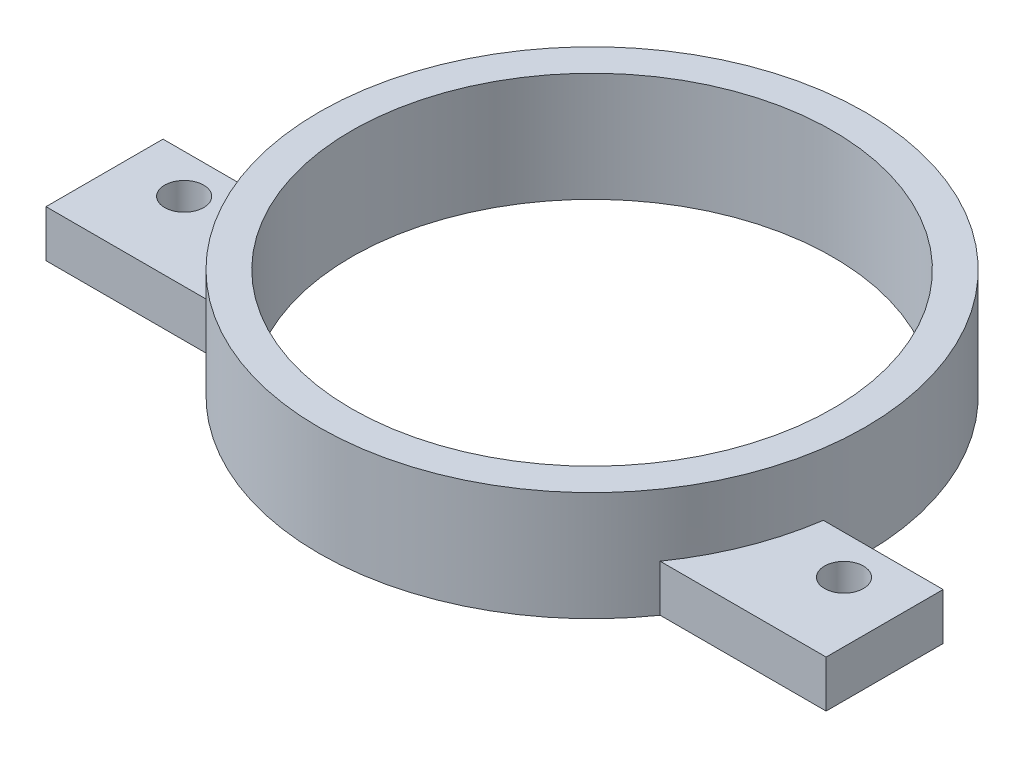
ISO-10303-21;
HEADER;
FILE_DESCRIPTION(('STEP AP214'),'2;1');
FILE_NAME('part.step','',(''),(''),'','','');
FILE_SCHEMA(('AUTOMOTIVE_DESIGN { 1 0 10303 214 1 1 1 1 }'));
ENDSEC;
DATA;
#1=APPLICATION_CONTEXT('core data for automotive mechanical design processes');
#2=APPLICATION_PROTOCOL_DEFINITION('international standard','automotive_design',2000,#1);
#3=PRODUCT_CONTEXT('',#1,'mechanical');
#4=PRODUCT('Part','Part','',(#3));
#5=PRODUCT_RELATED_PRODUCT_CATEGORY('part','',(#4));
#6=PRODUCT_DEFINITION_FORMATION('','',#4);
#7=PRODUCT_DEFINITION_CONTEXT('part definition',#1,'design');
#8=PRODUCT_DEFINITION('design','',#6,#7);
#9=PRODUCT_DEFINITION_SHAPE('','',#8);
#10=(LENGTH_UNIT() NAMED_UNIT(*) SI_UNIT(.MILLI.,.METRE.));
#11=(NAMED_UNIT(*) PLANE_ANGLE_UNIT() SI_UNIT($,.RADIAN.));
#12=(NAMED_UNIT(*) SI_UNIT($,.STERADIAN.) SOLID_ANGLE_UNIT());
#13=UNCERTAINTY_MEASURE_WITH_UNIT(LENGTH_MEASURE(1.E-05),#10,'distance_accuracy_value','');
#14=(GEOMETRIC_REPRESENTATION_CONTEXT(3) GLOBAL_UNCERTAINTY_ASSIGNED_CONTEXT((#13)) GLOBAL_UNIT_ASSIGNED_CONTEXT((#10,
#11,#12)) REPRESENTATION_CONTEXT('',''));
#15=CARTESIAN_POINT('',(0.,0.,0.));
#16=DIRECTION('',(0.,0.,1.));
#17=DIRECTION('',(1.,0.,0.));
#18=AXIS2_PLACEMENT_3D('',#15,#16,#17);
#19=CARTESIAN_POINT('',(0.,14.,0.));
#20=DIRECTION('',(0.,-1.,0.));
#21=DIRECTION('',(0.,0.,-1.));
#22=AXIS2_PLACEMENT_3D('',#19,#20,#21);
#23=CYLINDRICAL_SURFACE('',#22,35.);
#24=CARTESIAN_POINT('',(0.,14.,0.));
#25=DIRECTION('',(0.,1.,0.));
#26=DIRECTION('',(0.,0.,1.));
#27=AXIS2_PLACEMENT_3D('',#24,#25,#26);
#28=CIRCLE('',#27,35.);
#29=CARTESIAN_POINT('',(0.,14.,35.));
#30=VERTEX_POINT('',#29);
#31=EDGE_CURVE('E11',#30,#30,#28,.T.);
#32=ORIENTED_EDGE('',*,*,#31,.F.);
#33=EDGE_LOOP('',(#32));
#34=FACE_BOUND('',#33,.T.);
#35=DIRECTION('',(0.,-1.,0.));
#36=VECTOR('',#35,1.);
#37=CARTESIAN_POINT('',(-34.6410161513776,6.,5.));
#38=LINE('',#37,#36);
#39=CARTESIAN_POINT('',(-34.6410161513776,6.,5.));
#40=VERTEX_POINT('',#39);
#41=CARTESIAN_POINT('',(-34.6410161513776,0.,5.));
#42=VERTEX_POINT('',#41);
#43=EDGE_CURVE('E70',#40,#42,#38,.T.);
#44=ORIENTED_EDGE('',*,*,#43,.F.);
#45=CARTESIAN_POINT('',(0.,6.,0.));
#46=DIRECTION('',(0.,1.,0.));
#47=DIRECTION('',(0.,0.,1.));
#48=AXIS2_PLACEMENT_3D('',#45,#46,#47);
#49=CIRCLE('',#48,35.);
#50=CARTESIAN_POINT('',(-28.7228132326902,6.,20.));
#51=VERTEX_POINT('',#50);
#52=EDGE_CURVE('E65',#40,#51,#49,.T.);
#53=ORIENTED_EDGE('',*,*,#52,.T.);
#54=DIRECTION('',(0.,-1.,0.));
#55=VECTOR('',#54,1.);
#56=CARTESIAN_POINT('',(-28.7228132326901,6.,20.));
#57=LINE('',#56,#55);
#58=CARTESIAN_POINT('',(-28.7228132326901,0.,20.));
#59=VERTEX_POINT('',#58);
#60=EDGE_CURVE('E149',#51,#59,#57,.T.);
#61=ORIENTED_EDGE('',*,*,#60,.T.);
#62=CARTESIAN_POINT('',(0.,0.,0.));
#63=DIRECTION('',(0.,1.,0.));
#64=DIRECTION('',(0.,0.,1.));
#65=AXIS2_PLACEMENT_3D('',#62,#63,#64);
#66=CIRCLE('',#65,35.);
#67=CARTESIAN_POINT('',(28.7228132326902,0.,20.));
#68=VERTEX_POINT('',#67);
#69=EDGE_CURVE('E222',#59,#68,#66,.T.);
#70=ORIENTED_EDGE('',*,*,#69,.T.);
#71=DIRECTION('',(0.,-1.,0.));
#72=VECTOR('',#71,1.);
#73=CARTESIAN_POINT('',(28.7228132326901,6.,20.));
#74=LINE('',#73,#72);
#75=CARTESIAN_POINT('',(28.7228132326902,6.,20.));
#76=VERTEX_POINT('',#75);
#77=EDGE_CURVE('E213',#76,#68,#74,.T.);
#78=ORIENTED_EDGE('',*,*,#77,.F.);
#79=CARTESIAN_POINT('',(0.,6.,0.));
#80=DIRECTION('',(0.,1.,0.));
#81=DIRECTION('',(0.,0.,1.));
#82=AXIS2_PLACEMENT_3D('',#79,#80,#81);
#83=CIRCLE('',#82,35.);
#84=CARTESIAN_POINT('',(34.6410161513776,6.,5.));
#85=VERTEX_POINT('',#84);
#86=EDGE_CURVE('E174',#76,#85,#83,.T.);
#87=ORIENTED_EDGE('',*,*,#86,.T.);
#88=DIRECTION('',(0.,-1.,0.));
#89=VECTOR('',#88,1.);
#90=CARTESIAN_POINT('',(34.6410161513776,6.,5.));
#91=LINE('',#90,#89);
#92=CARTESIAN_POINT('',(34.6410161513776,0.,5.));
#93=VERTEX_POINT('',#92);
#94=EDGE_CURVE('E190',#85,#93,#91,.T.);
#95=ORIENTED_EDGE('',*,*,#94,.T.);
#96=EDGE_CURVE('E51',#93,#42,#66,.T.);
#97=ORIENTED_EDGE('',*,*,#96,.T.);
#98=EDGE_LOOP('',(#44,#53,#61,#70,#78,#87,#95,#97));
#99=FACE_BOUND('',#98,.T.);
#100=ADVANCED_FACE('F47',(#34,#99),#23,.T.);
#101=CARTESIAN_POINT('',(0.,14.,0.));
#102=DIRECTION('',(0.,-1.,0.));
#103=DIRECTION('',(0.,0.,-1.));
#104=AXIS2_PLACEMENT_3D('',#101,#102,#103);
#105=CYLINDRICAL_SURFACE('',#104,30.85);
#106=CARTESIAN_POINT('',(0.,14.,0.));
#107=DIRECTION('',(0.,1.,0.));
#108=DIRECTION('',(0.,0.,1.));
#109=AXIS2_PLACEMENT_3D('',#106,#107,#108);
#110=CIRCLE('',#109,30.85);
#111=CARTESIAN_POINT('',(0.,14.,30.85));
#112=VERTEX_POINT('',#111);
#113=EDGE_CURVE('E57',#112,#112,#110,.T.);
#114=ORIENTED_EDGE('',*,*,#113,.T.);
#115=EDGE_LOOP('',(#114));
#116=FACE_BOUND('',#115,.T.);
#117=CARTESIAN_POINT('',(0.,0.,0.));
#118=DIRECTION('',(0.,1.,0.));
#119=DIRECTION('',(0.,0.,1.));
#120=AXIS2_PLACEMENT_3D('',#117,#118,#119);
#121=CIRCLE('',#120,30.85);
#122=CARTESIAN_POINT('',(0.,0.,30.85));
#123=VERTEX_POINT('',#122);
#124=EDGE_CURVE('E217',#123,#123,#121,.T.);
#125=ORIENTED_EDGE('',*,*,#124,.F.);
#126=EDGE_LOOP('',(#125));
#127=FACE_BOUND('',#126,.T.);
#128=ADVANCED_FACE('F49',(#116,#127),#105,.F.);
#129=CARTESIAN_POINT('',(0.,14.,0.));
#130=DIRECTION('',(0.,1.,0.));
#131=DIRECTION('',(0.,0.,1.));
#132=AXIS2_PLACEMENT_3D('',#129,#130,#131);
#133=PLANE('',#132);
#134=ORIENTED_EDGE('',*,*,#113,.F.);
#135=EDGE_LOOP('',(#134));
#136=FACE_BOUND('',#135,.T.);
#137=ORIENTED_EDGE('',*,*,#31,.T.);
#138=EDGE_LOOP('',(#137));
#139=FACE_BOUND('',#138,.T.);
#140=ADVANCED_FACE('F248',(#136,#139),#133,.T.);
#141=CARTESIAN_POINT('',(0.,0.,0.));
#142=DIRECTION('',(0.,1.,0.));
#143=DIRECTION('',(0.,0.,1.));
#144=AXIS2_PLACEMENT_3D('',#141,#142,#143);
#145=PLANE('',#144);
#146=ORIENTED_EDGE('',*,*,#124,.T.);
#147=EDGE_LOOP('',(#146));
#148=FACE_BOUND('',#147,.T.);
#149=ORIENTED_EDGE('',*,*,#96,.F.);
#150=DIRECTION('',(1.,0.,0.));
#151=VECTOR('',#150,1.);
#152=CARTESIAN_POINT('',(0.,0.,5.));
#153=LINE('',#152,#151);
#154=CARTESIAN_POINT('',(50.,0.,5.));
#155=VERTEX_POINT('',#154);
#156=EDGE_CURVE('E175',#93,#155,#153,.T.);
#157=ORIENTED_EDGE('',*,*,#156,.T.);
#158=DIRECTION('',(0.,0.,1.));
#159=VECTOR('',#158,1.);
#160=CARTESIAN_POINT('',(50.,0.,0.));
#161=LINE('',#160,#159);
#162=CARTESIAN_POINT('',(50.,0.,20.));
#163=VERTEX_POINT('',#162);
#164=EDGE_CURVE('E198',#155,#163,#161,.T.);
#165=ORIENTED_EDGE('',*,*,#164,.T.);
#166=DIRECTION('',(-1.,0.,0.));
#167=VECTOR('',#166,1.);
#168=CARTESIAN_POINT('',(0.,0.,20.));
#169=LINE('',#168,#167);
#170=EDGE_CURVE('E194',#163,#68,#169,.T.);
#171=ORIENTED_EDGE('',*,*,#170,.T.);
#172=ORIENTED_EDGE('',*,*,#69,.F.);
#173=DIRECTION('',(1.,0.,0.));
#174=VECTOR('',#173,1.);
#175=CARTESIAN_POINT('',(0.,0.,20.));
#176=LINE('',#175,#174);
#177=CARTESIAN_POINT('',(-50.,0.,20.));
#178=VERTEX_POINT('',#177);
#179=EDGE_CURVE('E155',#178,#59,#176,.T.);
#180=ORIENTED_EDGE('',*,*,#179,.F.);
#181=DIRECTION('',(0.,0.,1.));
#182=VECTOR('',#181,1.);
#183=CARTESIAN_POINT('',(-50.,0.,0.));
#184=LINE('',#183,#182);
#185=CARTESIAN_POINT('',(-50.,0.,5.));
#186=VERTEX_POINT('',#185);
#187=EDGE_CURVE('E152',#186,#178,#184,.T.);
#188=ORIENTED_EDGE('',*,*,#187,.F.);
#189=DIRECTION('',(-1.,0.,0.));
#190=VECTOR('',#189,1.);
#191=CARTESIAN_POINT('',(0.,0.,5.));
#192=LINE('',#191,#190);
#193=EDGE_CURVE('E127',#42,#186,#192,.T.);
#194=ORIENTED_EDGE('',*,*,#193,.F.);
#195=EDGE_LOOP('',(#149,#157,#165,#171,#172,#180,#188,#194));
#196=FACE_BOUND('',#195,.T.);
#197=CARTESIAN_POINT('',(42.2901994577491,0.,10.));
#198=DIRECTION('',(0.,1.,0.));
#199=DIRECTION('',(0.,0.,1.));
#200=AXIS2_PLACEMENT_3D('',#197,#198,#199);
#201=CIRCLE('',#200,2.5);
#202=CARTESIAN_POINT('',(42.2901994577491,0.,12.5));
#203=VERTEX_POINT('',#202);
#204=EDGE_CURVE('E169',#203,#203,#201,.T.);
#205=ORIENTED_EDGE('',*,*,#204,.T.);
#206=EDGE_LOOP('',(#205));
#207=FACE_BOUND('',#206,.T.);
#208=CARTESIAN_POINT('',(-42.2901994577491,0.,10.));
#209=DIRECTION('',(0.,1.,0.));
#210=DIRECTION('',(0.,0.,1.));
#211=AXIS2_PLACEMENT_3D('',#208,#209,#210);
#212=CIRCLE('',#211,2.5);
#213=CARTESIAN_POINT('',(-42.2901994577491,0.,12.5));
#214=VERTEX_POINT('',#213);
#215=EDGE_CURVE('E159',#214,#214,#212,.F.);
#216=ORIENTED_EDGE('',*,*,#215,.F.);
#217=EDGE_LOOP('',(#216));
#218=FACE_BOUND('',#217,.T.);
#219=ADVANCED_FACE('F229',(#148,#196,#207,#218),#145,.F.);
#220=CARTESIAN_POINT('',(0.,6.,20.));
#221=DIRECTION('',(0.,0.,1.));
#222=DIRECTION('',(1.,0.,0.));
#223=AXIS2_PLACEMENT_3D('',#220,#221,#222);
#224=PLANE('',#223);
#225=ORIENTED_EDGE('',*,*,#170,.F.);
#226=DIRECTION('',(0.,-1.,0.));
#227=VECTOR('',#226,1.);
#228=CARTESIAN_POINT('',(50.,6.,20.));
#229=LINE('',#228,#227);
#230=CARTESIAN_POINT('',(50.,6.,20.));
#231=VERTEX_POINT('',#230);
#232=EDGE_CURVE('E210',#231,#163,#229,.T.);
#233=ORIENTED_EDGE('',*,*,#232,.F.);
#234=DIRECTION('',(-1.,0.,0.));
#235=VECTOR('',#234,1.);
#236=CARTESIAN_POINT('',(0.,6.,20.));
#237=LINE('',#236,#235);
#238=EDGE_CURVE('E178',#231,#76,#237,.T.);
#239=ORIENTED_EDGE('',*,*,#238,.T.);
#240=ORIENTED_EDGE('',*,*,#77,.T.);
#241=EDGE_LOOP('',(#225,#233,#239,#240));
#242=FACE_BOUND('',#241,.T.);
#243=ADVANCED_FACE('F254',(#242),#224,.T.);
#244=CARTESIAN_POINT('',(50.,6.,0.));
#245=DIRECTION('',(1.,0.,0.));
#246=DIRECTION('',(0.,0.,-1.));
#247=AXIS2_PLACEMENT_3D('',#244,#245,#246);
#248=PLANE('',#247);
#249=ORIENTED_EDGE('',*,*,#164,.F.);
#250=DIRECTION('',(0.,-1.,0.));
#251=VECTOR('',#250,1.);
#252=CARTESIAN_POINT('',(50.,6.,5.));
#253=LINE('',#252,#251);
#254=CARTESIAN_POINT('',(50.,6.,5.));
#255=VERTEX_POINT('',#254);
#256=EDGE_CURVE('E207',#255,#155,#253,.T.);
#257=ORIENTED_EDGE('',*,*,#256,.F.);
#258=DIRECTION('',(0.,0.,1.));
#259=VECTOR('',#258,1.);
#260=CARTESIAN_POINT('',(50.,6.,0.));
#261=LINE('',#260,#259);
#262=EDGE_CURVE('E182',#255,#231,#261,.T.);
#263=ORIENTED_EDGE('',*,*,#262,.T.);
#264=ORIENTED_EDGE('',*,*,#232,.T.);
#265=EDGE_LOOP('',(#249,#257,#263,#264));
#266=FACE_BOUND('',#265,.T.);
#267=ADVANCED_FACE('F262',(#266),#248,.T.);
#268=CARTESIAN_POINT('',(42.2901994577491,6.,10.));
#269=DIRECTION('',(0.,-1.,0.));
#270=DIRECTION('',(0.,0.,-1.));
#271=AXIS2_PLACEMENT_3D('',#268,#269,#270);
#272=CYLINDRICAL_SURFACE('',#271,2.5);
#273=CARTESIAN_POINT('',(42.2901994577491,6.,10.));
#274=DIRECTION('',(0.,1.,0.));
#275=DIRECTION('',(0.,0.,1.));
#276=AXIS2_PLACEMENT_3D('',#273,#274,#275);
#277=CIRCLE('',#276,2.5);
#278=CARTESIAN_POINT('',(42.2901994577491,6.,12.5));
#279=VERTEX_POINT('',#278);
#280=EDGE_CURVE('E170',#279,#279,#277,.T.);
#281=ORIENTED_EDGE('',*,*,#280,.T.);
#282=EDGE_LOOP('',(#281));
#283=FACE_BOUND('',#282,.T.);
#284=ORIENTED_EDGE('',*,*,#204,.F.);
#285=EDGE_LOOP('',(#284));
#286=FACE_BOUND('',#285,.T.);
#287=ADVANCED_FACE('F258',(#283,#286),#272,.F.);
#288=CARTESIAN_POINT('',(0.,6.,5.));
#289=DIRECTION('',(0.,0.,-1.));
#290=DIRECTION('',(-1.,0.,0.));
#291=AXIS2_PLACEMENT_3D('',#288,#289,#290);
#292=PLANE('',#291);
#293=ORIENTED_EDGE('',*,*,#156,.F.);
#294=ORIENTED_EDGE('',*,*,#94,.F.);
#295=DIRECTION('',(1.,0.,0.));
#296=VECTOR('',#295,1.);
#297=CARTESIAN_POINT('',(0.,6.,5.));
#298=LINE('',#297,#296);
#299=EDGE_CURVE('E186',#85,#255,#298,.T.);
#300=ORIENTED_EDGE('',*,*,#299,.T.);
#301=ORIENTED_EDGE('',*,*,#256,.T.);
#302=EDGE_LOOP('',(#293,#294,#300,#301));
#303=FACE_BOUND('',#302,.T.);
#304=ADVANCED_FACE('F261',(#303),#292,.T.);
#305=CARTESIAN_POINT('',(0.,6.,0.));
#306=DIRECTION('',(0.,1.,0.));
#307=DIRECTION('',(0.,0.,1.));
#308=AXIS2_PLACEMENT_3D('',#305,#306,#307);
#309=PLANE('',#308);
#310=ORIENTED_EDGE('',*,*,#280,.F.);
#311=EDGE_LOOP('',(#310));
#312=FACE_BOUND('',#311,.T.);
#313=ORIENTED_EDGE('',*,*,#86,.F.);
#314=ORIENTED_EDGE('',*,*,#238,.F.);
#315=ORIENTED_EDGE('',*,*,#262,.F.);
#316=ORIENTED_EDGE('',*,*,#299,.F.);
#317=EDGE_LOOP('',(#313,#314,#315,#316));
#318=FACE_BOUND('',#317,.T.);
#319=ADVANCED_FACE('F272',(#312,#318),#309,.T.);
#320=CARTESIAN_POINT('',(0.,6.,5.));
#321=DIRECTION('',(0.,0.,1.));
#322=DIRECTION('',(1.,0.,0.));
#323=AXIS2_PLACEMENT_3D('',#320,#321,#322);
#324=PLANE('',#323);
#325=ORIENTED_EDGE('',*,*,#193,.T.);
#326=DIRECTION('',(0.,-1.,0.));
#327=VECTOR('',#326,1.);
#328=CARTESIAN_POINT('',(-50.,6.,5.));
#329=LINE('',#328,#327);
#330=CARTESIAN_POINT('',(-50.,6.,5.));
#331=VERTEX_POINT('',#330);
#332=EDGE_CURVE('E124',#331,#186,#329,.T.);
#333=ORIENTED_EDGE('',*,*,#332,.F.);
#334=DIRECTION('',(-1.,0.,0.));
#335=VECTOR('',#334,1.);
#336=CARTESIAN_POINT('',(0.,6.,5.));
#337=LINE('',#336,#335);
#338=EDGE_CURVE('E113',#40,#331,#337,.T.);
#339=ORIENTED_EDGE('',*,*,#338,.F.);
#340=ORIENTED_EDGE('',*,*,#43,.T.);
#341=EDGE_LOOP('',(#325,#333,#339,#340));
#342=FACE_BOUND('',#341,.T.);
#343=ADVANCED_FACE('F125',(#342),#324,.F.);
#344=CARTESIAN_POINT('',(-50.,6.,0.));
#345=DIRECTION('',(1.,0.,0.));
#346=DIRECTION('',(0.,0.,-1.));
#347=AXIS2_PLACEMENT_3D('',#344,#345,#346);
#348=PLANE('',#347);
#349=ORIENTED_EDGE('',*,*,#187,.T.);
#350=DIRECTION('',(0.,-1.,0.));
#351=VECTOR('',#350,1.);
#352=CARTESIAN_POINT('',(-50.,6.,20.));
#353=LINE('',#352,#351);
#354=CARTESIAN_POINT('',(-50.,6.,20.));
#355=VERTEX_POINT('',#354);
#356=EDGE_CURVE('E131',#355,#178,#353,.T.);
#357=ORIENTED_EDGE('',*,*,#356,.F.);
#358=DIRECTION('',(0.,0.,1.));
#359=VECTOR('',#358,1.);
#360=CARTESIAN_POINT('',(-50.,6.,0.));
#361=LINE('',#360,#359);
#362=EDGE_CURVE('E118',#331,#355,#361,.T.);
#363=ORIENTED_EDGE('',*,*,#362,.F.);
#364=ORIENTED_EDGE('',*,*,#332,.T.);
#365=EDGE_LOOP('',(#349,#357,#363,#364));
#366=FACE_BOUND('',#365,.T.);
#367=ADVANCED_FACE('F133',(#366),#348,.F.);
#368=CARTESIAN_POINT('',(0.,6.,20.));
#369=DIRECTION('',(0.,0.,-1.));
#370=DIRECTION('',(-1.,0.,0.));
#371=AXIS2_PLACEMENT_3D('',#368,#369,#370);
#372=PLANE('',#371);
#373=ORIENTED_EDGE('',*,*,#179,.T.);
#374=ORIENTED_EDGE('',*,*,#60,.F.);
#375=DIRECTION('',(1.,0.,0.));
#376=VECTOR('',#375,1.);
#377=CARTESIAN_POINT('',(0.,6.,20.));
#378=LINE('',#377,#376);
#379=EDGE_CURVE('E137',#355,#51,#378,.T.);
#380=ORIENTED_EDGE('',*,*,#379,.F.);
#381=ORIENTED_EDGE('',*,*,#356,.T.);
#382=EDGE_LOOP('',(#373,#374,#380,#381));
#383=FACE_BOUND('',#382,.T.);
#384=ADVANCED_FACE('F233',(#383),#372,.F.);
#385=CARTESIAN_POINT('',(-42.2901994577491,6.,10.));
#386=DIRECTION('',(0.,-1.,0.));
#387=DIRECTION('',(0.,0.,-1.));
#388=AXIS2_PLACEMENT_3D('',#385,#386,#387);
#389=CYLINDRICAL_SURFACE('',#388,2.5);
#390=CARTESIAN_POINT('',(-42.2901994577491,6.,10.));
#391=DIRECTION('',(0.,1.,0.));
#392=DIRECTION('',(0.,0.,1.));
#393=AXIS2_PLACEMENT_3D('',#390,#391,#392);
#394=CIRCLE('',#393,2.5);
#395=CARTESIAN_POINT('',(-42.2901994577491,6.,12.5));
#396=VERTEX_POINT('',#395);
#397=EDGE_CURVE('E142',#396,#396,#394,.F.);
#398=ORIENTED_EDGE('',*,*,#397,.F.);
#399=EDGE_LOOP('',(#398));
#400=FACE_BOUND('',#399,.T.);
#401=ORIENTED_EDGE('',*,*,#215,.T.);
#402=EDGE_LOOP('',(#401));
#403=FACE_BOUND('',#402,.T.);
#404=ADVANCED_FACE('F236',(#400,#403),#389,.F.);
#405=CARTESIAN_POINT('',(0.,6.,0.));
#406=DIRECTION('',(0.,1.,0.));
#407=DIRECTION('',(0.,0.,1.));
#408=AXIS2_PLACEMENT_3D('',#405,#406,#407);
#409=PLANE('',#408);
#410=ORIENTED_EDGE('',*,*,#52,.F.);
#411=ORIENTED_EDGE('',*,*,#338,.T.);
#412=ORIENTED_EDGE('',*,*,#362,.T.);
#413=ORIENTED_EDGE('',*,*,#379,.T.);
#414=EDGE_LOOP('',(#410,#411,#412,#413));
#415=FACE_BOUND('',#414,.T.);
#416=ORIENTED_EDGE('',*,*,#397,.T.);
#417=EDGE_LOOP('',(#416));
#418=FACE_BOUND('',#417,.T.);
#419=ADVANCED_FACE('F115',(#415,#418),#409,.T.);
#420=CLOSED_SHELL('',(#100,#128,#140,#219,#243,#267,#287,#304,#319,#343,#367,#384,#404,#419));
#421=MANIFOLD_SOLID_BREP('B2',#420);
#422=ADVANCED_BREP_SHAPE_REPRESENTATION('',(#18,#421),#14);
#423=SHAPE_DEFINITION_REPRESENTATION(#9,#422);
ENDSEC;
END-ISO-10303-21;
